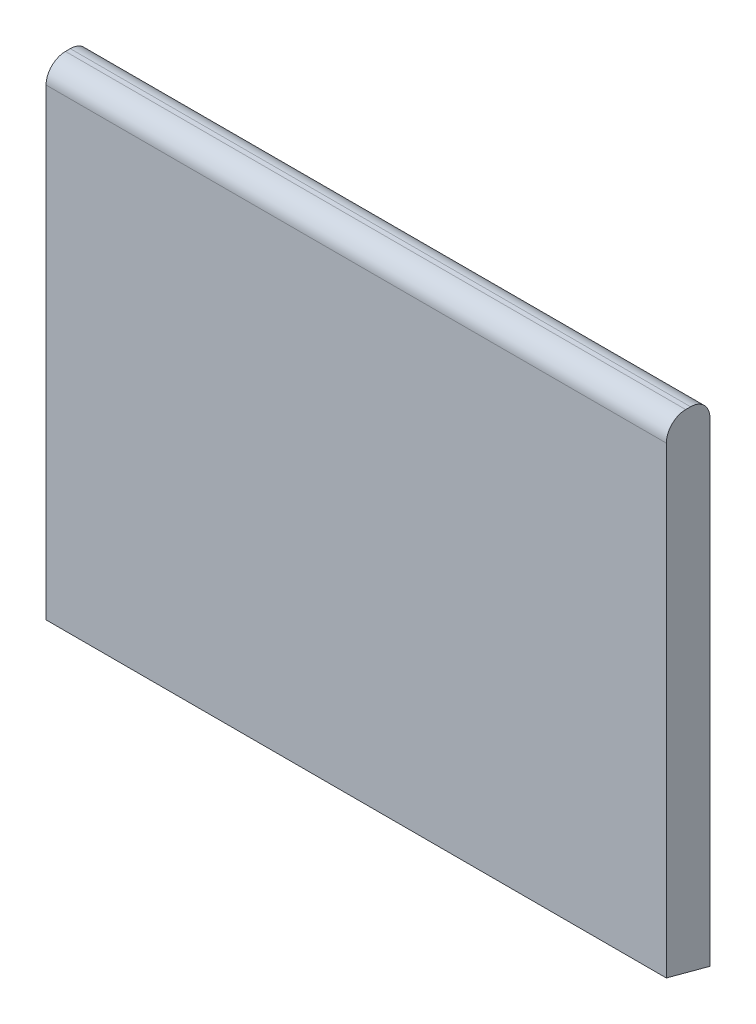
ISO-10303-21;
HEADER;
FILE_DESCRIPTION(('STEP AP214'),'2;1');
FILE_NAME('part.step','',(''),(''),'','','');
FILE_SCHEMA(('AUTOMOTIVE_DESIGN { 1 0 10303 214 1 1 1 1 }'));
ENDSEC;
DATA;
#1=APPLICATION_CONTEXT('core data for automotive mechanical design processes');
#2=APPLICATION_PROTOCOL_DEFINITION('international standard','automotive_design',2000,#1);
#3=PRODUCT_CONTEXT('',#1,'mechanical');
#4=PRODUCT('Part','Part','',(#3));
#5=PRODUCT_RELATED_PRODUCT_CATEGORY('part','',(#4));
#6=PRODUCT_DEFINITION_FORMATION('','',#4);
#7=PRODUCT_DEFINITION_CONTEXT('part definition',#1,'design');
#8=PRODUCT_DEFINITION('design','',#6,#7);
#9=PRODUCT_DEFINITION_SHAPE('','',#8);
#10=(LENGTH_UNIT() NAMED_UNIT(*) SI_UNIT(.MILLI.,.METRE.));
#11=(NAMED_UNIT(*) PLANE_ANGLE_UNIT() SI_UNIT($,.RADIAN.));
#12=(NAMED_UNIT(*) SI_UNIT($,.STERADIAN.) SOLID_ANGLE_UNIT());
#13=UNCERTAINTY_MEASURE_WITH_UNIT(LENGTH_MEASURE(1.E-05),#10,'distance_accuracy_value','');
#14=(GEOMETRIC_REPRESENTATION_CONTEXT(3) GLOBAL_UNCERTAINTY_ASSIGNED_CONTEXT((#13)) GLOBAL_UNIT_ASSIGNED_CONTEXT((#10,
#11,#12)) REPRESENTATION_CONTEXT('',''));
#15=CARTESIAN_POINT('',(0.,0.,0.));
#16=DIRECTION('',(0.,0.,1.));
#17=DIRECTION('',(1.,0.,0.));
#18=AXIS2_PLACEMENT_3D('',#15,#16,#17);
#19=CARTESIAN_POINT('',(0.,0.,18.));
#20=DIRECTION('',(1.,0.,0.));
#21=DIRECTION('',(0.,0.,-1.));
#22=AXIS2_PLACEMENT_3D('',#19,#20,#21);
#23=PLANE('',#22);
#24=DIRECTION('',(0.,-1.,0.));
#25=VECTOR('',#24,1.);
#26=CARTESIAN_POINT('',(0.,0.,0.));
#27=LINE('',#26,#25);
#28=CARTESIAN_POINT('',(0.,196.,0.));
#29=VERTEX_POINT('',#28);
#30=CARTESIAN_POINT('',(0.,0.,0.));
#31=VERTEX_POINT('',#30);
#32=EDGE_CURVE('E96',#29,#31,#27,.T.);
#33=ORIENTED_EDGE('',*,*,#32,.T.);
#34=DIRECTION('',(0.,0.258819045102514,0.96592582628907));
#35=VECTOR('',#34,1.);
#36=CARTESIAN_POINT('',(0.,4.82308546376008,18.));
#37=LINE('',#36,#35);
#38=CARTESIAN_POINT('',(0.,4.82308546376008,18.));
#39=VERTEX_POINT('',#38);
#40=EDGE_CURVE('E93',#31,#39,#37,.T.);
#41=ORIENTED_EDGE('',*,*,#40,.T.);
#42=DIRECTION('',(0.,-1.,0.));
#43=VECTOR('',#42,1.);
#44=CARTESIAN_POINT('',(0.,0.,18.));
#45=LINE('',#44,#43);
#46=CARTESIAN_POINT('',(0.,196.,18.));
#47=VERTEX_POINT('',#46);
#48=EDGE_CURVE('E105',#47,#39,#45,.T.);
#49=ORIENTED_EDGE('',*,*,#48,.F.);
#50=CARTESIAN_POINT('',(0.,196.,10.));
#51=DIRECTION('',(1.,0.,0.));
#52=DIRECTION('',(0.,0.,-1.));
#53=AXIS2_PLACEMENT_3D('',#50,#51,#52);
#54=CIRCLE('',#53,8.);
#55=CARTESIAN_POINT('',(0.,204.,10.));
#56=VERTEX_POINT('',#55);
#57=EDGE_CURVE('E118',#47,#56,#54,.F.);
#58=ORIENTED_EDGE('',*,*,#57,.T.);
#59=DIRECTION('',(0.,0.,-1.));
#60=VECTOR('',#59,1.);
#61=CARTESIAN_POINT('',(0.,204.,18.));
#62=LINE('',#61,#60);
#63=CARTESIAN_POINT('',(0.,204.,8.));
#64=VERTEX_POINT('',#63);
#65=EDGE_CURVE('E127',#56,#64,#62,.T.);
#66=ORIENTED_EDGE('',*,*,#65,.T.);
#67=CARTESIAN_POINT('',(0.,196.,8.));
#68=DIRECTION('',(1.,0.,0.));
#69=DIRECTION('',(0.,0.,-1.));
#70=AXIS2_PLACEMENT_3D('',#67,#68,#69);
#71=CIRCLE('',#70,8.);
#72=EDGE_CURVE('E120',#64,#29,#71,.F.);
#73=ORIENTED_EDGE('',*,*,#72,.T.);
#74=EDGE_LOOP('',(#33,#41,#49,#58,#66,#73));
#75=FACE_BOUND('',#74,.T.);
#76=ADVANCED_FACE('F32',(#75),#23,.F.);
#77=CARTESIAN_POINT('',(256.,0.,18.));
#78=DIRECTION('',(-1.,0.,0.));
#79=DIRECTION('',(0.,0.,1.));
#80=AXIS2_PLACEMENT_3D('',#77,#78,#79);
#81=PLANE('',#80);
#82=DIRECTION('',(0.,1.,0.));
#83=VECTOR('',#82,1.);
#84=CARTESIAN_POINT('',(256.,0.,18.));
#85=LINE('',#84,#83);
#86=CARTESIAN_POINT('',(256.,4.82308546376008,18.));
#87=VERTEX_POINT('',#86);
#88=CARTESIAN_POINT('',(256.,196.,18.));
#89=VERTEX_POINT('',#88);
#90=EDGE_CURVE('E101',#87,#89,#85,.T.);
#91=ORIENTED_EDGE('',*,*,#90,.F.);
#92=DIRECTION('',(0.,-0.258819045102514,-0.96592582628907));
#93=VECTOR('',#92,1.);
#94=CARTESIAN_POINT('',(256.,4.49999999999989,16.79422863406));
#95=LINE('',#94,#93);
#96=CARTESIAN_POINT('',(256.000006,0.,0.));
#97=VERTEX_POINT('',#96);
#98=EDGE_CURVE('E90',#87,#97,#95,.T.);
#99=ORIENTED_EDGE('',*,*,#98,.T.);
#100=DIRECTION('',(0.,1.,0.));
#101=VECTOR('',#100,1.);
#102=CARTESIAN_POINT('',(256.,0.,0.));
#103=LINE('',#102,#101);
#104=CARTESIAN_POINT('',(256.,196.,0.));
#105=VERTEX_POINT('',#104);
#106=EDGE_CURVE('E95',#97,#105,#103,.T.);
#107=ORIENTED_EDGE('',*,*,#106,.T.);
#108=CARTESIAN_POINT('',(256.,196.,8.));
#109=DIRECTION('',(-1.,0.,0.));
#110=DIRECTION('',(0.,0.,1.));
#111=AXIS2_PLACEMENT_3D('',#108,#109,#110);
#112=CIRCLE('',#111,8.);
#113=CARTESIAN_POINT('',(256.,204.,8.));
#114=VERTEX_POINT('',#113);
#115=EDGE_CURVE('E54',#105,#114,#112,.F.);
#116=ORIENTED_EDGE('',*,*,#115,.T.);
#117=DIRECTION('',(0.,0.,-1.));
#118=VECTOR('',#117,1.);
#119=CARTESIAN_POINT('',(256.,204.,18.));
#120=LINE('',#119,#118);
#121=CARTESIAN_POINT('',(256.,204.,10.));
#122=VERTEX_POINT('',#121);
#123=EDGE_CURVE('E125',#122,#114,#120,.T.);
#124=ORIENTED_EDGE('',*,*,#123,.F.);
#125=CARTESIAN_POINT('',(256.,196.,10.));
#126=DIRECTION('',(-1.,0.,0.));
#127=DIRECTION('',(0.,0.,1.));
#128=AXIS2_PLACEMENT_3D('',#125,#126,#127);
#129=CIRCLE('',#128,8.);
#130=EDGE_CURVE('E41',#122,#89,#129,.F.);
#131=ORIENTED_EDGE('',*,*,#130,.T.);
#132=EDGE_LOOP('',(#91,#99,#107,#116,#124,#131));
#133=FACE_BOUND('',#132,.T.);
#134=ADVANCED_FACE('F99',(#133),#81,.F.);
#135=CARTESIAN_POINT('',(0.,204.,18.));
#136=DIRECTION('',(0.,-1.,0.));
#137=DIRECTION('',(0.,0.,-1.));
#138=AXIS2_PLACEMENT_3D('',#135,#136,#137);
#139=PLANE('',#138);
#140=ORIENTED_EDGE('',*,*,#65,.F.);
#141=DIRECTION('',(-1.,0.,0.));
#142=VECTOR('',#141,1.);
#143=CARTESIAN_POINT('',(0.,204.,10.));
#144=LINE('',#143,#142);
#145=EDGE_CURVE('E113',#56,#122,#144,.F.);
#146=ORIENTED_EDGE('',*,*,#145,.T.);
#147=ORIENTED_EDGE('',*,*,#123,.T.);
#148=DIRECTION('',(-1.,0.,0.));
#149=VECTOR('',#148,1.);
#150=CARTESIAN_POINT('',(0.,204.,8.));
#151=LINE('',#150,#149);
#152=EDGE_CURVE('E115',#114,#64,#151,.T.);
#153=ORIENTED_EDGE('',*,*,#152,.T.);
#154=EDGE_LOOP('',(#140,#146,#147,#153));
#155=FACE_BOUND('',#154,.T.);
#156=ADVANCED_FACE('F146',(#155),#139,.F.);
#157=CARTESIAN_POINT('',(0.,0.,18.));
#158=DIRECTION('',(0.,0.,-1.));
#159=DIRECTION('',(-1.,0.,0.));
#160=AXIS2_PLACEMENT_3D('',#157,#158,#159);
#161=PLANE('',#160);
#162=ORIENTED_EDGE('',*,*,#48,.T.);
#163=DIRECTION('',(1.,0.,0.));
#164=VECTOR('',#163,1.);
#165=CARTESIAN_POINT('',(0.,4.82308546376008,18.));
#166=LINE('',#165,#164);
#167=EDGE_CURVE('E102',#39,#87,#166,.T.);
#168=ORIENTED_EDGE('',*,*,#167,.T.);
#169=ORIENTED_EDGE('',*,*,#90,.T.);
#170=DIRECTION('',(-1.,0.,0.));
#171=VECTOR('',#170,1.);
#172=CARTESIAN_POINT('',(0.,196.,18.));
#173=LINE('',#172,#171);
#174=EDGE_CURVE('E122',#89,#47,#173,.T.);
#175=ORIENTED_EDGE('',*,*,#174,.T.);
#176=EDGE_LOOP('',(#162,#168,#169,#175));
#177=FACE_BOUND('',#176,.T.);
#178=ADVANCED_FACE('F138',(#177),#161,.F.);
#179=CARTESIAN_POINT('',(0.,0.,0.));
#180=DIRECTION('',(0.,0.,-1.));
#181=DIRECTION('',(-1.,0.,0.));
#182=AXIS2_PLACEMENT_3D('',#179,#180,#181);
#183=PLANE('',#182);
#184=ORIENTED_EDGE('',*,*,#32,.F.);
#185=DIRECTION('',(-1.,0.,0.));
#186=VECTOR('',#185,1.);
#187=CARTESIAN_POINT('',(256.,196.,0.));
#188=LINE('',#187,#186);
#189=EDGE_CURVE('E11',#29,#105,#188,.F.);
#190=ORIENTED_EDGE('',*,*,#189,.T.);
#191=ORIENTED_EDGE('',*,*,#106,.F.);
#192=DIRECTION('',(1.,0.,0.));
#193=VECTOR('',#192,1.);
#194=CARTESIAN_POINT('',(0.,0.,0.));
#195=LINE('',#194,#193);
#196=EDGE_CURVE('E87',#31,#97,#195,.T.);
#197=ORIENTED_EDGE('',*,*,#196,.F.);
#198=EDGE_LOOP('',(#184,#190,#191,#197));
#199=FACE_BOUND('',#198,.T.);
#200=ADVANCED_FACE('F104',(#199),#183,.T.);
#201=CARTESIAN_POINT('',(0.,196.,10.));
#202=DIRECTION('',(-1.,0.,0.));
#203=DIRECTION('',(0.,0.,1.));
#204=AXIS2_PLACEMENT_3D('',#201,#202,#203);
#205=CYLINDRICAL_SURFACE('',#204,8.);
#206=ORIENTED_EDGE('',*,*,#130,.F.);
#207=ORIENTED_EDGE('',*,*,#145,.F.);
#208=ORIENTED_EDGE('',*,*,#57,.F.);
#209=ORIENTED_EDGE('',*,*,#174,.F.);
#210=EDGE_LOOP('',(#206,#207,#208,#209));
#211=FACE_BOUND('',#210,.T.);
#212=ADVANCED_FACE('F142',(#211),#205,.T.);
#213=CARTESIAN_POINT('',(0.,196.,8.));
#214=DIRECTION('',(1.,0.,0.));
#215=DIRECTION('',(0.,0.,-1.));
#216=AXIS2_PLACEMENT_3D('',#213,#214,#215);
#217=CYLINDRICAL_SURFACE('',#216,8.);
#218=ORIENTED_EDGE('',*,*,#115,.F.);
#219=ORIENTED_EDGE('',*,*,#189,.F.);
#220=ORIENTED_EDGE('',*,*,#72,.F.);
#221=ORIENTED_EDGE('',*,*,#152,.F.);
#222=EDGE_LOOP('',(#218,#219,#220,#221));
#223=FACE_BOUND('',#222,.T.);
#224=ADVANCED_FACE('F34',(#223),#217,.T.);
#225=CARTESIAN_POINT('',(0.,4.82308546376008,18.));
#226=DIRECTION('',(0.,0.96592582628907,-0.258819045102514));
#227=DIRECTION('',(0.,0.258819045102514,0.96592582628907));
#228=AXIS2_PLACEMENT_3D('',#225,#226,#227);
#229=PLANE('',#228);
#230=ORIENTED_EDGE('',*,*,#167,.F.);
#231=ORIENTED_EDGE('',*,*,#40,.F.);
#232=ORIENTED_EDGE('',*,*,#196,.T.);
#233=ORIENTED_EDGE('',*,*,#98,.F.);
#234=EDGE_LOOP('',(#230,#231,#232,#233));
#235=FACE_BOUND('',#234,.T.);
#236=ADVANCED_FACE('F89',(#235),#229,.F.);
#237=CLOSED_SHELL('',(#76,#134,#156,#178,#200,#212,#224,#236));
#238=MANIFOLD_SOLID_BREP('B2',#237);
#239=ADVANCED_BREP_SHAPE_REPRESENTATION('',(#18,#238),#14);
#240=SHAPE_DEFINITION_REPRESENTATION(#9,#239);
ENDSEC;
END-ISO-10303-21;
